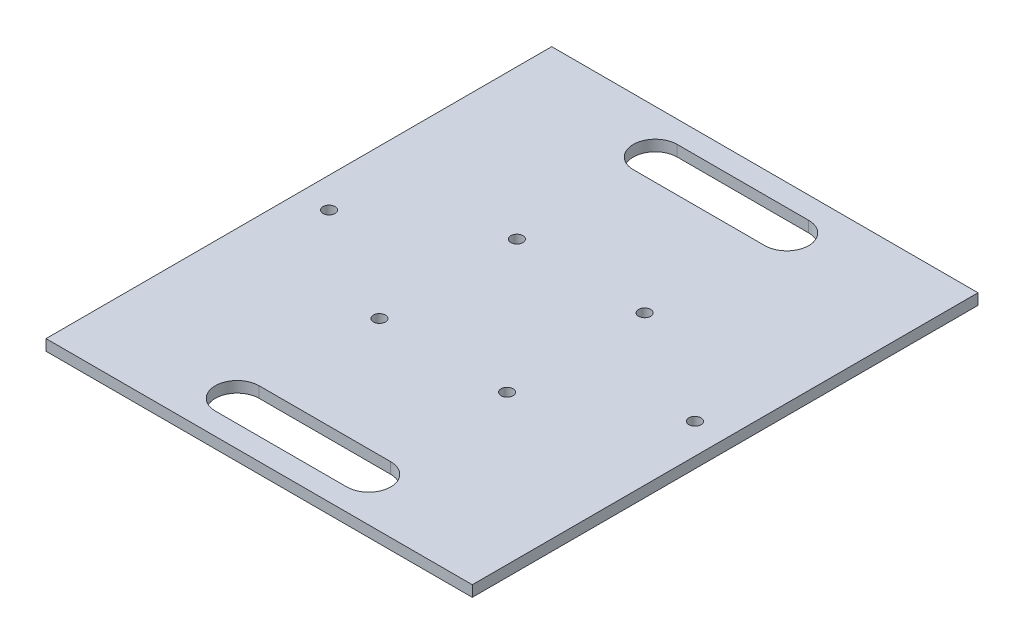
ISO-10303-21;
HEADER;
FILE_DESCRIPTION(('STEP AP214'),'2;1');
FILE_NAME('part.step','',(''),(''),'','','');
FILE_SCHEMA(('AUTOMOTIVE_DESIGN { 1 0 10303 214 1 1 1 1 }'));
ENDSEC;
DATA;
#1=APPLICATION_CONTEXT('core data for automotive mechanical design processes');
#2=APPLICATION_PROTOCOL_DEFINITION('international standard','automotive_design',2000,#1);
#3=PRODUCT_CONTEXT('',#1,'mechanical');
#4=PRODUCT('Part','Part','',(#3));
#5=PRODUCT_RELATED_PRODUCT_CATEGORY('part','',(#4));
#6=PRODUCT_DEFINITION_FORMATION('','',#4);
#7=PRODUCT_DEFINITION_CONTEXT('part definition',#1,'design');
#8=PRODUCT_DEFINITION('design','',#6,#7);
#9=PRODUCT_DEFINITION_SHAPE('','',#8);
#10=(LENGTH_UNIT() NAMED_UNIT(*) SI_UNIT(.MILLI.,.METRE.));
#11=(NAMED_UNIT(*) PLANE_ANGLE_UNIT() SI_UNIT($,.RADIAN.));
#12=(NAMED_UNIT(*) SI_UNIT($,.STERADIAN.) SOLID_ANGLE_UNIT());
#13=UNCERTAINTY_MEASURE_WITH_UNIT(LENGTH_MEASURE(1.E-05),#10,'distance_accuracy_value','');
#14=(GEOMETRIC_REPRESENTATION_CONTEXT(3) GLOBAL_UNCERTAINTY_ASSIGNED_CONTEXT((#13)) GLOBAL_UNIT_ASSIGNED_CONTEXT((#10,
#11,#12)) REPRESENTATION_CONTEXT('',''));
#15=CARTESIAN_POINT('',(0.,0.,0.));
#16=DIRECTION('',(0.,0.,1.));
#17=DIRECTION('',(1.,0.,0.));
#18=AXIS2_PLACEMENT_3D('',#15,#16,#17);
#19=CARTESIAN_POINT('',(123.5,3.175,146.5));
#20=DIRECTION('',(-1.,0.,0.));
#21=DIRECTION('',(0.,0.,1.));
#22=AXIS2_PLACEMENT_3D('',#19,#20,#21);
#23=PLANE('',#22);
#24=DIRECTION('',(0.,0.,-1.));
#25=VECTOR('',#24,1.);
#26=CARTESIAN_POINT('',(123.5,-3.175,146.5));
#27=LINE('',#26,#25);
#28=CARTESIAN_POINT('',(123.5,-3.175,146.5));
#29=VERTEX_POINT('',#28);
#30=CARTESIAN_POINT('',(123.5,-3.175,-146.5));
#31=VERTEX_POINT('',#30);
#32=EDGE_CURVE('E165',#29,#31,#27,.T.);
#33=ORIENTED_EDGE('',*,*,#32,.T.);
#34=DIRECTION('',(0.,-1.,0.));
#35=VECTOR('',#34,1.);
#36=CARTESIAN_POINT('',(123.5,3.175,-146.5));
#37=LINE('',#36,#35);
#38=CARTESIAN_POINT('',(123.5,3.175,-146.5));
#39=VERTEX_POINT('',#38);
#40=EDGE_CURVE('E11',#39,#31,#37,.T.);
#41=ORIENTED_EDGE('',*,*,#40,.F.);
#42=DIRECTION('',(0.,0.,-1.));
#43=VECTOR('',#42,1.);
#44=CARTESIAN_POINT('',(123.5,3.175,146.5));
#45=LINE('',#44,#43);
#46=CARTESIAN_POINT('',(123.5,3.175,146.5));
#47=VERTEX_POINT('',#46);
#48=EDGE_CURVE('E199',#47,#39,#45,.T.);
#49=ORIENTED_EDGE('',*,*,#48,.F.);
#50=DIRECTION('',(0.,-1.,0.));
#51=VECTOR('',#50,1.);
#52=CARTESIAN_POINT('',(123.5,3.175,146.5));
#53=LINE('',#52,#51);
#54=EDGE_CURVE('E209',#47,#29,#53,.T.);
#55=ORIENTED_EDGE('',*,*,#54,.T.);
#56=EDGE_LOOP('',(#33,#41,#49,#55));
#57=FACE_BOUND('',#56,.T.);
#58=ADVANCED_FACE('F38',(#57),#23,.F.);
#59=CARTESIAN_POINT('',(-123.5,3.175,-146.5));
#60=DIRECTION('',(0.,0.,1.));
#61=DIRECTION('',(1.,0.,0.));
#62=AXIS2_PLACEMENT_3D('',#59,#60,#61);
#63=PLANE('',#62);
#64=DIRECTION('',(-1.,0.,0.));
#65=VECTOR('',#64,1.);
#66=CARTESIAN_POINT('',(-123.5,-3.175,-146.5));
#67=LINE('',#66,#65);
#68=CARTESIAN_POINT('',(-123.5,-3.175,-146.5));
#69=VERTEX_POINT('',#68);
#70=EDGE_CURVE('E212',#31,#69,#67,.T.);
#71=ORIENTED_EDGE('',*,*,#70,.T.);
#72=DIRECTION('',(0.,-1.,0.));
#73=VECTOR('',#72,1.);
#74=CARTESIAN_POINT('',(-123.5,3.175,-146.5));
#75=LINE('',#74,#73);
#76=CARTESIAN_POINT('',(-123.5,3.175,-146.5));
#77=VERTEX_POINT('',#76);
#78=EDGE_CURVE('E45',#77,#69,#75,.T.);
#79=ORIENTED_EDGE('',*,*,#78,.F.);
#80=DIRECTION('',(-1.,0.,0.));
#81=VECTOR('',#80,1.);
#82=CARTESIAN_POINT('',(-123.5,3.175,-146.5));
#83=LINE('',#82,#81);
#84=EDGE_CURVE('E202',#39,#77,#83,.T.);
#85=ORIENTED_EDGE('',*,*,#84,.F.);
#86=ORIENTED_EDGE('',*,*,#40,.T.);
#87=EDGE_LOOP('',(#71,#79,#85,#86));
#88=FACE_BOUND('',#87,.T.);
#89=ADVANCED_FACE('F241',(#88),#63,.F.);
#90=CARTESIAN_POINT('',(-123.5,3.175,146.5));
#91=DIRECTION('',(1.,0.,0.));
#92=DIRECTION('',(0.,0.,-1.));
#93=AXIS2_PLACEMENT_3D('',#90,#91,#92);
#94=PLANE('',#93);
#95=DIRECTION('',(0.,0.,1.));
#96=VECTOR('',#95,1.);
#97=CARTESIAN_POINT('',(-123.5,-3.175,146.5));
#98=LINE('',#97,#96);
#99=CARTESIAN_POINT('',(-123.5,-3.175,146.5));
#100=VERTEX_POINT('',#99);
#101=EDGE_CURVE('E214',#69,#100,#98,.T.);
#102=ORIENTED_EDGE('',*,*,#101,.T.);
#103=DIRECTION('',(0.,-1.,0.));
#104=VECTOR('',#103,1.);
#105=CARTESIAN_POINT('',(-123.5,3.175,146.5));
#106=LINE('',#105,#104);
#107=CARTESIAN_POINT('',(-123.5,3.175,146.5));
#108=VERTEX_POINT('',#107);
#109=EDGE_CURVE('E219',#108,#100,#106,.T.);
#110=ORIENTED_EDGE('',*,*,#109,.F.);
#111=DIRECTION('',(0.,0.,1.));
#112=VECTOR('',#111,1.);
#113=CARTESIAN_POINT('',(-123.5,3.175,146.5));
#114=LINE('',#113,#112);
#115=EDGE_CURVE('E205',#77,#108,#114,.T.);
#116=ORIENTED_EDGE('',*,*,#115,.F.);
#117=ORIENTED_EDGE('',*,*,#78,.T.);
#118=EDGE_LOOP('',(#102,#110,#116,#117));
#119=FACE_BOUND('',#118,.T.);
#120=ADVANCED_FACE('F226',(#119),#94,.F.);
#121=CARTESIAN_POINT('',(-123.5,3.175,146.5));
#122=DIRECTION('',(0.,0.,-1.));
#123=DIRECTION('',(-1.,0.,0.));
#124=AXIS2_PLACEMENT_3D('',#121,#122,#123);
#125=PLANE('',#124);
#126=DIRECTION('',(1.,0.,0.));
#127=VECTOR('',#126,1.);
#128=CARTESIAN_POINT('',(-123.5,-3.175,146.5));
#129=LINE('',#128,#127);
#130=EDGE_CURVE('E203',#100,#29,#129,.T.);
#131=ORIENTED_EDGE('',*,*,#130,.T.);
#132=ORIENTED_EDGE('',*,*,#54,.F.);
#133=DIRECTION('',(1.,0.,0.));
#134=VECTOR('',#133,1.);
#135=CARTESIAN_POINT('',(-123.5,3.175,146.5));
#136=LINE('',#135,#134);
#137=EDGE_CURVE('E207',#108,#47,#136,.T.);
#138=ORIENTED_EDGE('',*,*,#137,.F.);
#139=ORIENTED_EDGE('',*,*,#109,.T.);
#140=EDGE_LOOP('',(#131,#132,#138,#139));
#141=FACE_BOUND('',#140,.T.);
#142=ADVANCED_FACE('F234',(#141),#125,.F.);
#143=CARTESIAN_POINT('',(0.,3.175,0.));
#144=DIRECTION('',(0.,-1.,0.));
#145=DIRECTION('',(0.,0.,-1.));
#146=AXIS2_PLACEMENT_3D('',#143,#144,#145);
#147=PLANE('',#146);
#148=CARTESIAN_POINT('',(-106.,3.175,0.));
#149=DIRECTION('',(0.,1.,0.));
#150=DIRECTION('',(0.,0.,1.));
#151=AXIS2_PLACEMENT_3D('',#148,#149,#150);
#152=CIRCLE('',#151,3.499999985);
#153=CARTESIAN_POINT('',(-106.,3.175,3.499999985));
#154=VERTEX_POINT('',#153);
#155=EDGE_CURVE('E315',#154,#154,#152,.T.);
#156=ORIENTED_EDGE('',*,*,#155,.F.);
#157=EDGE_LOOP('',(#156));
#158=FACE_BOUND('',#157,.T.);
#159=CARTESIAN_POINT('',(-37.,3.175,39.8371685740842));
#160=DIRECTION('',(0.,1.,0.));
#161=DIRECTION('',(0.,0.,1.));
#162=AXIS2_PLACEMENT_3D('',#159,#160,#161);
#163=CIRCLE('',#162,3.499999985);
#164=CARTESIAN_POINT('',(-37.,3.175,43.3371685590842));
#165=VERTEX_POINT('',#164);
#166=EDGE_CURVE('E317',#165,#165,#163,.T.);
#167=ORIENTED_EDGE('',*,*,#166,.F.);
#168=EDGE_LOOP('',(#167));
#169=FACE_BOUND('',#168,.T.);
#170=CARTESIAN_POINT('',(-37.,3.175,-39.8371685740842));
#171=DIRECTION('',(0.,1.,0.));
#172=DIRECTION('',(0.,0.,1.));
#173=AXIS2_PLACEMENT_3D('',#170,#171,#172);
#174=CIRCLE('',#173,3.499999985);
#175=CARTESIAN_POINT('',(-37.,3.175,-36.3371685890842));
#176=VERTEX_POINT('',#175);
#177=EDGE_CURVE('E325',#176,#176,#174,.T.);
#178=ORIENTED_EDGE('',*,*,#177,.F.);
#179=EDGE_LOOP('',(#178));
#180=FACE_BOUND('',#179,.T.);
#181=CARTESIAN_POINT('',(37.,3.175,-39.8371685740842));
#182=DIRECTION('',(0.,1.,0.));
#183=DIRECTION('',(0.,0.,1.));
#184=AXIS2_PLACEMENT_3D('',#181,#182,#183);
#185=CIRCLE('',#184,3.499999985);
#186=CARTESIAN_POINT('',(37.,3.175,-36.3371685890842));
#187=VERTEX_POINT('',#186);
#188=EDGE_CURVE('E331',#187,#187,#185,.T.);
#189=ORIENTED_EDGE('',*,*,#188,.F.);
#190=EDGE_LOOP('',(#189));
#191=FACE_BOUND('',#190,.T.);
#192=CARTESIAN_POINT('',(37.,3.175,39.8371685740842));
#193=DIRECTION('',(0.,1.,0.));
#194=DIRECTION('',(0.,0.,1.));
#195=AXIS2_PLACEMENT_3D('',#192,#193,#194);
#196=CIRCLE('',#195,3.499999985);
#197=CARTESIAN_POINT('',(37.,3.175,43.3371685590842));
#198=VERTEX_POINT('',#197);
#199=EDGE_CURVE('E337',#198,#198,#196,.T.);
#200=ORIENTED_EDGE('',*,*,#199,.F.);
#201=EDGE_LOOP('',(#200));
#202=FACE_BOUND('',#201,.T.);
#203=CARTESIAN_POINT('',(106.,3.175,0.));
#204=DIRECTION('',(0.,1.,0.));
#205=DIRECTION('',(0.,0.,1.));
#206=AXIS2_PLACEMENT_3D('',#203,#204,#205);
#207=CIRCLE('',#206,3.499999985);
#208=CARTESIAN_POINT('',(106.,3.175,3.499999985));
#209=VERTEX_POINT('',#208);
#210=EDGE_CURVE('E342',#209,#209,#207,.T.);
#211=ORIENTED_EDGE('',*,*,#210,.F.);
#212=EDGE_LOOP('',(#211));
#213=FACE_BOUND('',#212,.T.);
#214=DIRECTION('',(1.,0.,0.));
#215=VECTOR('',#214,1.);
#216=CARTESIAN_POINT('',(-38.1,3.175,-108.4));
#217=LINE('',#216,#215);
#218=CARTESIAN_POINT('',(-38.1,3.175,-108.4));
#219=VERTEX_POINT('',#218);
#220=CARTESIAN_POINT('',(38.1,3.175,-108.4));
#221=VERTEX_POINT('',#220);
#222=EDGE_CURVE('E159',#219,#221,#217,.T.);
#223=ORIENTED_EDGE('',*,*,#222,.F.);
#224=CARTESIAN_POINT('',(-38.1,3.175,-121.1));
#225=DIRECTION('',(0.,1.,0.));
#226=DIRECTION('',(0.,0.,1.));
#227=AXIS2_PLACEMENT_3D('',#224,#225,#226);
#228=CIRCLE('',#227,12.7);
#229=CARTESIAN_POINT('',(-38.1,3.175,-133.8));
#230=VERTEX_POINT('',#229);
#231=EDGE_CURVE('E52',#230,#219,#228,.T.);
#232=ORIENTED_EDGE('',*,*,#231,.F.);
#233=DIRECTION('',(-1.,0.,0.));
#234=VECTOR('',#233,1.);
#235=CARTESIAN_POINT('',(-38.1,3.175,-133.8));
#236=LINE('',#235,#234);
#237=CARTESIAN_POINT('',(38.1,3.175,-133.8));
#238=VERTEX_POINT('',#237);
#239=EDGE_CURVE('E147',#238,#230,#236,.T.);
#240=ORIENTED_EDGE('',*,*,#239,.F.);
#241=CARTESIAN_POINT('',(38.1,3.175,-121.1));
#242=DIRECTION('',(0.,1.,0.));
#243=DIRECTION('',(0.,0.,1.));
#244=AXIS2_PLACEMENT_3D('',#241,#242,#243);
#245=CIRCLE('',#244,12.7);
#246=EDGE_CURVE('E150',#221,#238,#245,.T.);
#247=ORIENTED_EDGE('',*,*,#246,.F.);
#248=EDGE_LOOP('',(#223,#232,#240,#247));
#249=FACE_BOUND('',#248,.T.);
#250=DIRECTION('',(1.,0.,0.));
#251=VECTOR('',#250,1.);
#252=CARTESIAN_POINT('',(-38.1,3.175,133.8));
#253=LINE('',#252,#251);
#254=CARTESIAN_POINT('',(-38.1,3.175,133.8));
#255=VERTEX_POINT('',#254);
#256=CARTESIAN_POINT('',(38.1,3.175,133.8));
#257=VERTEX_POINT('',#256);
#258=EDGE_CURVE('E185',#255,#257,#253,.T.);
#259=ORIENTED_EDGE('',*,*,#258,.F.);
#260=CARTESIAN_POINT('',(-38.1,3.175,121.1));
#261=DIRECTION('',(0.,1.,0.));
#262=DIRECTION('',(0.,0.,-1.));
#263=AXIS2_PLACEMENT_3D('',#260,#261,#262);
#264=CIRCLE('',#263,12.7);
#265=CARTESIAN_POINT('',(-38.1,3.175,108.4));
#266=VERTEX_POINT('',#265);
#267=EDGE_CURVE('E60',#266,#255,#264,.T.);
#268=ORIENTED_EDGE('',*,*,#267,.F.);
#269=DIRECTION('',(-1.,0.,0.));
#270=VECTOR('',#269,1.);
#271=CARTESIAN_POINT('',(-38.1,3.175,108.4));
#272=LINE('',#271,#270);
#273=CARTESIAN_POINT('',(38.1,3.175,108.4));
#274=VERTEX_POINT('',#273);
#275=EDGE_CURVE('E178',#274,#266,#272,.T.);
#276=ORIENTED_EDGE('',*,*,#275,.F.);
#277=CARTESIAN_POINT('',(38.1,3.175,121.1));
#278=DIRECTION('',(0.,1.,0.));
#279=DIRECTION('',(0.,0.,-1.));
#280=AXIS2_PLACEMENT_3D('',#277,#278,#279);
#281=CIRCLE('',#280,12.7);
#282=EDGE_CURVE('E181',#257,#274,#281,.T.);
#283=ORIENTED_EDGE('',*,*,#282,.F.);
#284=EDGE_LOOP('',(#259,#268,#276,#283));
#285=FACE_BOUND('',#284,.T.);
#286=ORIENTED_EDGE('',*,*,#48,.T.);
#287=ORIENTED_EDGE('',*,*,#84,.T.);
#288=ORIENTED_EDGE('',*,*,#115,.T.);
#289=ORIENTED_EDGE('',*,*,#137,.T.);
#290=EDGE_LOOP('',(#286,#287,#288,#289));
#291=FACE_BOUND('',#290,.T.);
#292=ADVANCED_FACE('F240',(#158,#169,#180,#191,#202,#213,#249,#285,#291),#147,.F.);
#293=CARTESIAN_POINT('',(0.,-3.175,0.));
#294=DIRECTION('',(0.,-1.,0.));
#295=DIRECTION('',(0.,0.,-1.));
#296=AXIS2_PLACEMENT_3D('',#293,#294,#295);
#297=PLANE('',#296);
#298=CARTESIAN_POINT('',(-106.,-3.175,0.));
#299=DIRECTION('',(0.,1.,0.));
#300=DIRECTION('',(0.,0.,1.));
#301=AXIS2_PLACEMENT_3D('',#298,#299,#300);
#302=CIRCLE('',#301,3.499999985);
#303=CARTESIAN_POINT('',(-106.,-3.175,3.499999985));
#304=VERTEX_POINT('',#303);
#305=EDGE_CURVE('E312',#304,#304,#302,.T.);
#306=ORIENTED_EDGE('',*,*,#305,.T.);
#307=EDGE_LOOP('',(#306));
#308=FACE_BOUND('',#307,.T.);
#309=CARTESIAN_POINT('',(-37.,-3.175,39.8371685740842));
#310=DIRECTION('',(0.,1.,0.));
#311=DIRECTION('',(0.,0.,1.));
#312=AXIS2_PLACEMENT_3D('',#309,#310,#311);
#313=CIRCLE('',#312,3.499999985);
#314=CARTESIAN_POINT('',(-37.,-3.175,43.3371685590842));
#315=VERTEX_POINT('',#314);
#316=EDGE_CURVE('E322',#315,#315,#313,.T.);
#317=ORIENTED_EDGE('',*,*,#316,.T.);
#318=EDGE_LOOP('',(#317));
#319=FACE_BOUND('',#318,.T.);
#320=CARTESIAN_POINT('',(-37.,-3.175,-39.8371685740842));
#321=DIRECTION('',(0.,1.,0.));
#322=DIRECTION('',(0.,0.,1.));
#323=AXIS2_PLACEMENT_3D('',#320,#321,#322);
#324=CIRCLE('',#323,3.499999985);
#325=CARTESIAN_POINT('',(-37.,-3.175,-36.3371685890842));
#326=VERTEX_POINT('',#325);
#327=EDGE_CURVE('E328',#326,#326,#324,.T.);
#328=ORIENTED_EDGE('',*,*,#327,.T.);
#329=EDGE_LOOP('',(#328));
#330=FACE_BOUND('',#329,.T.);
#331=CARTESIAN_POINT('',(37.,-3.175,-39.8371685740842));
#332=DIRECTION('',(0.,1.,0.));
#333=DIRECTION('',(0.,0.,1.));
#334=AXIS2_PLACEMENT_3D('',#331,#332,#333);
#335=CIRCLE('',#334,3.499999985);
#336=CARTESIAN_POINT('',(37.,-3.175,-36.3371685890842));
#337=VERTEX_POINT('',#336);
#338=EDGE_CURVE('E334',#337,#337,#335,.T.);
#339=ORIENTED_EDGE('',*,*,#338,.T.);
#340=EDGE_LOOP('',(#339));
#341=FACE_BOUND('',#340,.T.);
#342=CARTESIAN_POINT('',(37.,-3.175,39.8371685740842));
#343=DIRECTION('',(0.,1.,0.));
#344=DIRECTION('',(0.,0.,1.));
#345=AXIS2_PLACEMENT_3D('',#342,#343,#344);
#346=CIRCLE('',#345,3.499999985);
#347=CARTESIAN_POINT('',(37.,-3.175,43.3371685590842));
#348=VERTEX_POINT('',#347);
#349=EDGE_CURVE('E340',#348,#348,#346,.T.);
#350=ORIENTED_EDGE('',*,*,#349,.T.);
#351=EDGE_LOOP('',(#350));
#352=FACE_BOUND('',#351,.T.);
#353=CARTESIAN_POINT('',(106.,-3.175,0.));
#354=DIRECTION('',(0.,1.,0.));
#355=DIRECTION('',(0.,0.,1.));
#356=AXIS2_PLACEMENT_3D('',#353,#354,#355);
#357=CIRCLE('',#356,3.499999985);
#358=CARTESIAN_POINT('',(106.,-3.175,3.499999985));
#359=VERTEX_POINT('',#358);
#360=EDGE_CURVE('E153',#359,#359,#357,.T.);
#361=ORIENTED_EDGE('',*,*,#360,.T.);
#362=EDGE_LOOP('',(#361));
#363=FACE_BOUND('',#362,.T.);
#364=CARTESIAN_POINT('',(-38.1,-3.175,-121.1));
#365=DIRECTION('',(0.,1.,0.));
#366=DIRECTION('',(0.,0.,1.));
#367=AXIS2_PLACEMENT_3D('',#364,#365,#366);
#368=CIRCLE('',#367,12.7);
#369=CARTESIAN_POINT('',(-38.1,-3.175,-133.8));
#370=VERTEX_POINT('',#369);
#371=CARTESIAN_POINT('',(-38.1,-3.175,-108.4));
#372=VERTEX_POINT('',#371);
#373=EDGE_CURVE('E128',#370,#372,#368,.T.);
#374=ORIENTED_EDGE('',*,*,#373,.T.);
#375=DIRECTION('',(1.,0.,0.));
#376=VECTOR('',#375,1.);
#377=CARTESIAN_POINT('',(-38.1,-3.175,-108.4));
#378=LINE('',#377,#376);
#379=CARTESIAN_POINT('',(38.1,-3.175,-108.4));
#380=VERTEX_POINT('',#379);
#381=EDGE_CURVE('E138',#372,#380,#378,.T.);
#382=ORIENTED_EDGE('',*,*,#381,.T.);
#383=CARTESIAN_POINT('',(38.1,-3.175,-121.1));
#384=DIRECTION('',(0.,1.,0.));
#385=DIRECTION('',(0.,0.,1.));
#386=AXIS2_PLACEMENT_3D('',#383,#384,#385);
#387=CIRCLE('',#386,12.7);
#388=CARTESIAN_POINT('',(38.1,-3.175,-133.8));
#389=VERTEX_POINT('',#388);
#390=EDGE_CURVE('E142',#380,#389,#387,.T.);
#391=ORIENTED_EDGE('',*,*,#390,.T.);
#392=DIRECTION('',(-1.,0.,0.));
#393=VECTOR('',#392,1.);
#394=CARTESIAN_POINT('',(-38.1,-3.175,-133.8));
#395=LINE('',#394,#393);
#396=EDGE_CURVE('E134',#389,#370,#395,.T.);
#397=ORIENTED_EDGE('',*,*,#396,.T.);
#398=EDGE_LOOP('',(#374,#382,#391,#397));
#399=FACE_BOUND('',#398,.T.);
#400=CARTESIAN_POINT('',(-38.1,-3.175,121.1));
#401=DIRECTION('',(0.,1.,0.));
#402=DIRECTION('',(0.,0.,-1.));
#403=AXIS2_PLACEMENT_3D('',#400,#401,#402);
#404=CIRCLE('',#403,12.7);
#405=CARTESIAN_POINT('',(-38.1,-3.175,108.4));
#406=VERTEX_POINT('',#405);
#407=CARTESIAN_POINT('',(-38.1,-3.175,133.8));
#408=VERTEX_POINT('',#407);
#409=EDGE_CURVE('E182',#406,#408,#404,.T.);
#410=ORIENTED_EDGE('',*,*,#409,.T.);
#411=DIRECTION('',(1.,0.,0.));
#412=VECTOR('',#411,1.);
#413=CARTESIAN_POINT('',(-38.1,-3.175,133.8));
#414=LINE('',#413,#412);
#415=CARTESIAN_POINT('',(38.1,-3.175,133.8));
#416=VERTEX_POINT('',#415);
#417=EDGE_CURVE('E194',#408,#416,#414,.T.);
#418=ORIENTED_EDGE('',*,*,#417,.T.);
#419=CARTESIAN_POINT('',(38.1,-3.175,121.1));
#420=DIRECTION('',(0.,1.,0.));
#421=DIRECTION('',(0.,0.,-1.));
#422=AXIS2_PLACEMENT_3D('',#419,#420,#421);
#423=CIRCLE('',#422,12.7);
#424=CARTESIAN_POINT('',(38.1,-3.175,108.4));
#425=VERTEX_POINT('',#424);
#426=EDGE_CURVE('E191',#416,#425,#423,.T.);
#427=ORIENTED_EDGE('',*,*,#426,.T.);
#428=DIRECTION('',(-1.,0.,0.));
#429=VECTOR('',#428,1.);
#430=CARTESIAN_POINT('',(-38.1,-3.175,108.4));
#431=LINE('',#430,#429);
#432=EDGE_CURVE('E171',#425,#406,#431,.T.);
#433=ORIENTED_EDGE('',*,*,#432,.T.);
#434=EDGE_LOOP('',(#410,#418,#427,#433));
#435=FACE_BOUND('',#434,.T.);
#436=ORIENTED_EDGE('',*,*,#32,.F.);
#437=ORIENTED_EDGE('',*,*,#130,.F.);
#438=ORIENTED_EDGE('',*,*,#101,.F.);
#439=ORIENTED_EDGE('',*,*,#70,.F.);
#440=EDGE_LOOP('',(#436,#437,#438,#439));
#441=FACE_BOUND('',#440,.T.);
#442=ADVANCED_FACE('F144',(#308,#319,#330,#341,#352,#363,#399,#435,#441),#297,.T.);
#443=CARTESIAN_POINT('',(-38.1,-3.175,121.1));
#444=DIRECTION('',(0.,1.,0.));
#445=DIRECTION('',(0.,0.,1.));
#446=AXIS2_PLACEMENT_3D('',#443,#444,#445);
#447=CYLINDRICAL_SURFACE('',#446,12.7);
#448=ORIENTED_EDGE('',*,*,#267,.T.);
#449=DIRECTION('',(0.,1.,0.));
#450=VECTOR('',#449,1.);
#451=CARTESIAN_POINT('',(-38.1,-3.175,133.8));
#452=LINE('',#451,#450);
#453=EDGE_CURVE('E169',#408,#255,#452,.T.);
#454=ORIENTED_EDGE('',*,*,#453,.F.);
#455=ORIENTED_EDGE('',*,*,#409,.F.);
#456=DIRECTION('',(0.,1.,0.));
#457=VECTOR('',#456,1.);
#458=CARTESIAN_POINT('',(-38.1,-3.175,108.4));
#459=LINE('',#458,#457);
#460=EDGE_CURVE('E176',#406,#266,#459,.T.);
#461=ORIENTED_EDGE('',*,*,#460,.T.);
#462=EDGE_LOOP('',(#448,#454,#455,#461));
#463=FACE_BOUND('',#462,.T.);
#464=ADVANCED_FACE('F253',(#463),#447,.F.);
#465=CARTESIAN_POINT('',(-38.1,-3.175,108.4));
#466=DIRECTION('',(0.,0.,-1.));
#467=DIRECTION('',(-1.,0.,0.));
#468=AXIS2_PLACEMENT_3D('',#465,#466,#467);
#469=PLANE('',#468);
#470=ORIENTED_EDGE('',*,*,#275,.T.);
#471=ORIENTED_EDGE('',*,*,#460,.F.);
#472=ORIENTED_EDGE('',*,*,#432,.F.);
#473=DIRECTION('',(0.,1.,0.));
#474=VECTOR('',#473,1.);
#475=CARTESIAN_POINT('',(38.1,-3.175,108.4));
#476=LINE('',#475,#474);
#477=EDGE_CURVE('E174',#425,#274,#476,.T.);
#478=ORIENTED_EDGE('',*,*,#477,.T.);
#479=EDGE_LOOP('',(#470,#471,#472,#478));
#480=FACE_BOUND('',#479,.T.);
#481=ADVANCED_FACE('F258',(#480),#469,.F.);
#482=CARTESIAN_POINT('',(38.1,-3.175,121.1));
#483=DIRECTION('',(0.,1.,0.));
#484=DIRECTION('',(0.,0.,1.));
#485=AXIS2_PLACEMENT_3D('',#482,#483,#484);
#486=CYLINDRICAL_SURFACE('',#485,12.7);
#487=ORIENTED_EDGE('',*,*,#282,.T.);
#488=ORIENTED_EDGE('',*,*,#477,.F.);
#489=ORIENTED_EDGE('',*,*,#426,.F.);
#490=DIRECTION('',(0.,1.,0.));
#491=VECTOR('',#490,1.);
#492=CARTESIAN_POINT('',(38.1,-3.175,133.8));
#493=LINE('',#492,#491);
#494=EDGE_CURVE('E172',#416,#257,#493,.T.);
#495=ORIENTED_EDGE('',*,*,#494,.T.);
#496=EDGE_LOOP('',(#487,#488,#489,#495));
#497=FACE_BOUND('',#496,.T.);
#498=ADVANCED_FACE('F261',(#497),#486,.F.);
#499=CARTESIAN_POINT('',(-38.1,-3.175,133.8));
#500=DIRECTION('',(0.,0.,1.));
#501=DIRECTION('',(1.,0.,0.));
#502=AXIS2_PLACEMENT_3D('',#499,#500,#501);
#503=PLANE('',#502);
#504=ORIENTED_EDGE('',*,*,#258,.T.);
#505=ORIENTED_EDGE('',*,*,#494,.F.);
#506=ORIENTED_EDGE('',*,*,#417,.F.);
#507=ORIENTED_EDGE('',*,*,#453,.T.);
#508=EDGE_LOOP('',(#504,#505,#506,#507));
#509=FACE_BOUND('',#508,.T.);
#510=ADVANCED_FACE('F265',(#509),#503,.F.);
#511=CARTESIAN_POINT('',(-38.1,-3.175,-121.1));
#512=DIRECTION('',(0.,1.,0.));
#513=DIRECTION('',(0.,0.,1.));
#514=AXIS2_PLACEMENT_3D('',#511,#512,#513);
#515=CYLINDRICAL_SURFACE('',#514,12.7);
#516=ORIENTED_EDGE('',*,*,#231,.T.);
#517=DIRECTION('',(0.,1.,0.));
#518=VECTOR('',#517,1.);
#519=CARTESIAN_POINT('',(-38.1,-3.175,-108.4));
#520=LINE('',#519,#518);
#521=EDGE_CURVE('E124',#372,#219,#520,.T.);
#522=ORIENTED_EDGE('',*,*,#521,.F.);
#523=ORIENTED_EDGE('',*,*,#373,.F.);
#524=DIRECTION('',(0.,1.,0.));
#525=VECTOR('',#524,1.);
#526=CARTESIAN_POINT('',(-38.1,-3.175,-133.8));
#527=LINE('',#526,#525);
#528=EDGE_CURVE('E163',#370,#230,#527,.T.);
#529=ORIENTED_EDGE('',*,*,#528,.T.);
#530=EDGE_LOOP('',(#516,#522,#523,#529));
#531=FACE_BOUND('',#530,.T.);
#532=ADVANCED_FACE('F126',(#531),#515,.F.);
#533=CARTESIAN_POINT('',(-38.1,-3.175,-133.8));
#534=DIRECTION('',(0.,0.,-1.));
#535=DIRECTION('',(-1.,0.,0.));
#536=AXIS2_PLACEMENT_3D('',#533,#534,#535);
#537=PLANE('',#536);
#538=ORIENTED_EDGE('',*,*,#239,.T.);
#539=ORIENTED_EDGE('',*,*,#528,.F.);
#540=ORIENTED_EDGE('',*,*,#396,.F.);
#541=DIRECTION('',(0.,1.,0.));
#542=VECTOR('',#541,1.);
#543=CARTESIAN_POINT('',(38.1,-3.175,-133.8));
#544=LINE('',#543,#542);
#545=EDGE_CURVE('E166',#389,#238,#544,.T.);
#546=ORIENTED_EDGE('',*,*,#545,.T.);
#547=EDGE_LOOP('',(#538,#539,#540,#546));
#548=FACE_BOUND('',#547,.T.);
#549=ADVANCED_FACE('F274',(#548),#537,.F.);
#550=CARTESIAN_POINT('',(38.1,-3.175,-121.1));
#551=DIRECTION('',(0.,1.,0.));
#552=DIRECTION('',(0.,0.,1.));
#553=AXIS2_PLACEMENT_3D('',#550,#551,#552);
#554=CYLINDRICAL_SURFACE('',#553,12.7);
#555=ORIENTED_EDGE('',*,*,#246,.T.);
#556=ORIENTED_EDGE('',*,*,#545,.F.);
#557=ORIENTED_EDGE('',*,*,#390,.F.);
#558=DIRECTION('',(0.,1.,0.));
#559=VECTOR('',#558,1.);
#560=CARTESIAN_POINT('',(38.1,-3.175,-108.4));
#561=LINE('',#560,#559);
#562=EDGE_CURVE('E133',#380,#221,#561,.T.);
#563=ORIENTED_EDGE('',*,*,#562,.T.);
#564=EDGE_LOOP('',(#555,#556,#557,#563));
#565=FACE_BOUND('',#564,.T.);
#566=ADVANCED_FACE('F278',(#565),#554,.F.);
#567=CARTESIAN_POINT('',(-38.1,-3.175,-108.4));
#568=DIRECTION('',(0.,0.,1.));
#569=DIRECTION('',(1.,0.,0.));
#570=AXIS2_PLACEMENT_3D('',#567,#568,#569);
#571=PLANE('',#570);
#572=ORIENTED_EDGE('',*,*,#222,.T.);
#573=ORIENTED_EDGE('',*,*,#562,.F.);
#574=ORIENTED_EDGE('',*,*,#381,.F.);
#575=ORIENTED_EDGE('',*,*,#521,.T.);
#576=EDGE_LOOP('',(#572,#573,#574,#575));
#577=FACE_BOUND('',#576,.T.);
#578=ADVANCED_FACE('F139',(#577),#571,.F.);
#579=CARTESIAN_POINT('',(106.,3.175,0.));
#580=DIRECTION('',(0.,1.,0.));
#581=DIRECTION('',(0.,0.,1.));
#582=AXIS2_PLACEMENT_3D('',#579,#580,#581);
#583=CYLINDRICAL_SURFACE('',#582,3.499999985);
#584=ORIENTED_EDGE('',*,*,#360,.F.);
#585=EDGE_LOOP('',(#584));
#586=FACE_BOUND('',#585,.T.);
#587=ORIENTED_EDGE('',*,*,#210,.T.);
#588=EDGE_LOOP('',(#587));
#589=FACE_BOUND('',#588,.T.);
#590=ADVANCED_FACE('F277',(#586,#589),#583,.F.);
#591=CARTESIAN_POINT('',(37.,3.175,39.8371685740842));
#592=DIRECTION('',(0.,1.,0.));
#593=DIRECTION('',(0.,0.,1.));
#594=AXIS2_PLACEMENT_3D('',#591,#592,#593);
#595=CYLINDRICAL_SURFACE('',#594,3.499999985);
#596=ORIENTED_EDGE('',*,*,#349,.F.);
#597=EDGE_LOOP('',(#596));
#598=FACE_BOUND('',#597,.T.);
#599=ORIENTED_EDGE('',*,*,#199,.T.);
#600=EDGE_LOOP('',(#599));
#601=FACE_BOUND('',#600,.T.);
#602=ADVANCED_FACE('F287',(#598,#601),#595,.F.);
#603=CARTESIAN_POINT('',(37.,3.175,-39.8371685740842));
#604=DIRECTION('',(0.,1.,0.));
#605=DIRECTION('',(0.,0.,1.));
#606=AXIS2_PLACEMENT_3D('',#603,#604,#605);
#607=CYLINDRICAL_SURFACE('',#606,3.499999985);
#608=ORIENTED_EDGE('',*,*,#338,.F.);
#609=EDGE_LOOP('',(#608));
#610=FACE_BOUND('',#609,.T.);
#611=ORIENTED_EDGE('',*,*,#188,.T.);
#612=EDGE_LOOP('',(#611));
#613=FACE_BOUND('',#612,.T.);
#614=ADVANCED_FACE('F291',(#610,#613),#607,.F.);
#615=CARTESIAN_POINT('',(-37.,3.175,-39.8371685740842));
#616=DIRECTION('',(0.,1.,0.));
#617=DIRECTION('',(0.,0.,1.));
#618=AXIS2_PLACEMENT_3D('',#615,#616,#617);
#619=CYLINDRICAL_SURFACE('',#618,3.499999985);
#620=ORIENTED_EDGE('',*,*,#327,.F.);
#621=EDGE_LOOP('',(#620));
#622=FACE_BOUND('',#621,.T.);
#623=ORIENTED_EDGE('',*,*,#177,.T.);
#624=EDGE_LOOP('',(#623));
#625=FACE_BOUND('',#624,.T.);
#626=ADVANCED_FACE('F295',(#622,#625),#619,.F.);
#627=CARTESIAN_POINT('',(-37.,3.175,39.8371685740842));
#628=DIRECTION('',(0.,1.,0.));
#629=DIRECTION('',(0.,0.,1.));
#630=AXIS2_PLACEMENT_3D('',#627,#628,#629);
#631=CYLINDRICAL_SURFACE('',#630,3.499999985);
#632=ORIENTED_EDGE('',*,*,#316,.F.);
#633=EDGE_LOOP('',(#632));
#634=FACE_BOUND('',#633,.T.);
#635=ORIENTED_EDGE('',*,*,#166,.T.);
#636=EDGE_LOOP('',(#635));
#637=FACE_BOUND('',#636,.T.);
#638=ADVANCED_FACE('F299',(#634,#637),#631,.F.);
#639=CARTESIAN_POINT('',(-106.,3.175,0.));
#640=DIRECTION('',(0.,1.,0.));
#641=DIRECTION('',(0.,0.,1.));
#642=AXIS2_PLACEMENT_3D('',#639,#640,#641);
#643=CYLINDRICAL_SURFACE('',#642,3.499999985);
#644=ORIENTED_EDGE('',*,*,#305,.F.);
#645=EDGE_LOOP('',(#644));
#646=FACE_BOUND('',#645,.T.);
#647=ORIENTED_EDGE('',*,*,#155,.T.);
#648=EDGE_LOOP('',(#647));
#649=FACE_BOUND('',#648,.T.);
#650=ADVANCED_FACE('F303',(#646,#649),#643,.F.);
#651=CLOSED_SHELL('',(#58,#89,#120,#142,#292,#442,#464,#481,#498,#510,#532,#549,#566,#578,#590,
#602,#614,#626,#638,#650));
#652=MANIFOLD_SOLID_BREP('B2',#651);
#653=ADVANCED_BREP_SHAPE_REPRESENTATION('',(#18,#652),#14);
#654=SHAPE_DEFINITION_REPRESENTATION(#9,#653);
ENDSEC;
END-ISO-10303-21;
